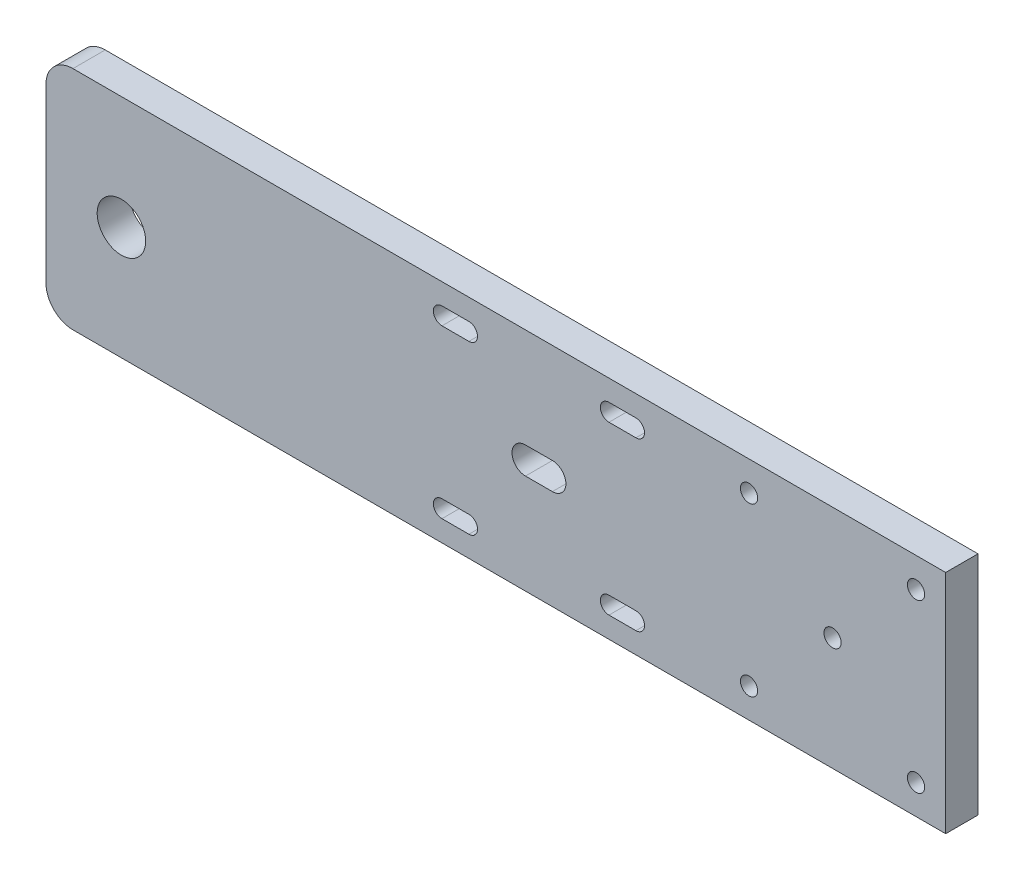
ISO-10303-21;
HEADER;
FILE_DESCRIPTION(('STEP AP214'),'2;1');
FILE_NAME('part.step','',(''),(''),'','','');
FILE_SCHEMA(('AUTOMOTIVE_DESIGN { 1 0 10303 214 1 1 1 1 }'));
ENDSEC;
DATA;
#1=APPLICATION_CONTEXT('core data for automotive mechanical design processes');
#2=APPLICATION_PROTOCOL_DEFINITION('international standard','automotive_design',2000,#1);
#3=PRODUCT_CONTEXT('',#1,'mechanical');
#4=PRODUCT('Part','Part','',(#3));
#5=PRODUCT_RELATED_PRODUCT_CATEGORY('part','',(#4));
#6=PRODUCT_DEFINITION_FORMATION('','',#4);
#7=PRODUCT_DEFINITION_CONTEXT('part definition',#1,'design');
#8=PRODUCT_DEFINITION('design','',#6,#7);
#9=PRODUCT_DEFINITION_SHAPE('','',#8);
#10=(LENGTH_UNIT() NAMED_UNIT(*) SI_UNIT(.MILLI.,.METRE.));
#11=(NAMED_UNIT(*) PLANE_ANGLE_UNIT() SI_UNIT($,.RADIAN.));
#12=(NAMED_UNIT(*) SI_UNIT($,.STERADIAN.) SOLID_ANGLE_UNIT());
#13=UNCERTAINTY_MEASURE_WITH_UNIT(LENGTH_MEASURE(1.E-05),#10,'distance_accuracy_value','');
#14=(GEOMETRIC_REPRESENTATION_CONTEXT(3) GLOBAL_UNCERTAINTY_ASSIGNED_CONTEXT((#13)) GLOBAL_UNIT_ASSIGNED_CONTEXT((#10,
#11,#12)) REPRESENTATION_CONTEXT('',''));
#15=CARTESIAN_POINT('',(0.,0.,0.));
#16=DIRECTION('',(0.,0.,1.));
#17=DIRECTION('',(1.,0.,0.));
#18=AXIS2_PLACEMENT_3D('',#15,#16,#17);
#19=CARTESIAN_POINT('',(-52.,0.,6.));
#20=DIRECTION('',(0.,0.,-1.));
#21=DIRECTION('',(-1.,0.,0.));
#22=AXIS2_PLACEMENT_3D('',#19,#20,#21);
#23=CYLINDRICAL_SURFACE('',#22,2.5);
#24=CARTESIAN_POINT('',(-52.,0.,0.));
#25=DIRECTION('',(0.,0.,1.));
#26=DIRECTION('',(1.,0.,0.));
#27=AXIS2_PLACEMENT_3D('',#24,#25,#26);
#28=CIRCLE('',#27,2.5);
#29=CARTESIAN_POINT('',(-52.,-2.5,0.));
#30=VERTEX_POINT('',#29);
#31=CARTESIAN_POINT('',(-52.,2.5,0.));
#32=VERTEX_POINT('',#31);
#33=EDGE_CURVE('E396',#30,#32,#28,.T.);
#34=ORIENTED_EDGE('',*,*,#33,.F.);
#35=DIRECTION('',(0.,0.,-1.));
#36=VECTOR('',#35,1.);
#37=CARTESIAN_POINT('',(-52.,-2.5,6.));
#38=LINE('',#37,#36);
#39=CARTESIAN_POINT('',(-52.,-2.5,6.));
#40=VERTEX_POINT('',#39);
#41=EDGE_CURVE('E429',#40,#30,#38,.T.);
#42=ORIENTED_EDGE('',*,*,#41,.F.);
#43=CARTESIAN_POINT('',(-52.,0.,6.));
#44=DIRECTION('',(0.,0.,1.));
#45=DIRECTION('',(1.,0.,0.));
#46=AXIS2_PLACEMENT_3D('',#43,#44,#45);
#47=CIRCLE('',#46,2.5);
#48=CARTESIAN_POINT('',(-52.,2.5,6.));
#49=VERTEX_POINT('',#48);
#50=EDGE_CURVE('E312',#40,#49,#47,.T.);
#51=ORIENTED_EDGE('',*,*,#50,.T.);
#52=DIRECTION('',(0.,0.,-1.));
#53=VECTOR('',#52,1.);
#54=CARTESIAN_POINT('',(-52.,2.5,6.));
#55=LINE('',#54,#53);
#56=EDGE_CURVE('E422',#49,#32,#55,.T.);
#57=ORIENTED_EDGE('',*,*,#56,.T.);
#58=EDGE_LOOP('',(#34,#42,#51,#57));
#59=FACE_BOUND('',#58,.T.);
#60=ADVANCED_FACE('F62',(#59),#23,.F.);
#61=CARTESIAN_POINT('',(0.,-2.5,6.));
#62=DIRECTION('',(0.,1.,0.));
#63=DIRECTION('',(0.,0.,1.));
#64=AXIS2_PLACEMENT_3D('',#61,#62,#63);
#65=PLANE('',#64);
#66=DIRECTION('',(1.,0.,0.));
#67=VECTOR('',#66,1.);
#68=CARTESIAN_POINT('',(0.,-2.5,0.));
#69=LINE('',#68,#67);
#70=CARTESIAN_POINT('',(-57.,-2.5,0.));
#71=VERTEX_POINT('',#70);
#72=EDGE_CURVE('E399',#71,#30,#69,.T.);
#73=ORIENTED_EDGE('',*,*,#72,.F.);
#74=DIRECTION('',(0.,0.,-1.));
#75=VECTOR('',#74,1.);
#76=CARTESIAN_POINT('',(-57.,-2.5,6.));
#77=LINE('',#76,#75);
#78=CARTESIAN_POINT('',(-57.,-2.5,6.));
#79=VERTEX_POINT('',#78);
#80=EDGE_CURVE('E427',#79,#71,#77,.T.);
#81=ORIENTED_EDGE('',*,*,#80,.F.);
#82=DIRECTION('',(1.,0.,0.));
#83=VECTOR('',#82,1.);
#84=CARTESIAN_POINT('',(0.,-2.5,6.));
#85=LINE('',#84,#83);
#86=EDGE_CURVE('E315',#79,#40,#85,.T.);
#87=ORIENTED_EDGE('',*,*,#86,.T.);
#88=ORIENTED_EDGE('',*,*,#41,.T.);
#89=EDGE_LOOP('',(#73,#81,#87,#88));
#90=FACE_BOUND('',#89,.T.);
#91=ADVANCED_FACE('F520',(#90),#65,.T.);
#92=CARTESIAN_POINT('',(-57.,0.,6.));
#93=DIRECTION('',(0.,0.,-1.));
#94=DIRECTION('',(-1.,0.,0.));
#95=AXIS2_PLACEMENT_3D('',#92,#93,#94);
#96=CYLINDRICAL_SURFACE('',#95,2.5);
#97=CARTESIAN_POINT('',(-57.,0.,0.));
#98=DIRECTION('',(0.,0.,1.));
#99=DIRECTION('',(1.,0.,0.));
#100=AXIS2_PLACEMENT_3D('',#97,#98,#99);
#101=CIRCLE('',#100,2.5);
#102=CARTESIAN_POINT('',(-57.,2.5,0.));
#103=VERTEX_POINT('',#102);
#104=EDGE_CURVE('E402',#103,#71,#101,.T.);
#105=ORIENTED_EDGE('',*,*,#104,.F.);
#106=DIRECTION('',(0.,0.,-1.));
#107=VECTOR('',#106,1.);
#108=CARTESIAN_POINT('',(-57.,2.5,6.));
#109=LINE('',#108,#107);
#110=CARTESIAN_POINT('',(-57.,2.5,6.));
#111=VERTEX_POINT('',#110);
#112=EDGE_CURVE('E424',#111,#103,#109,.T.);
#113=ORIENTED_EDGE('',*,*,#112,.F.);
#114=CARTESIAN_POINT('',(-57.,0.,6.));
#115=DIRECTION('',(0.,0.,1.));
#116=DIRECTION('',(1.,0.,0.));
#117=AXIS2_PLACEMENT_3D('',#114,#115,#116);
#118=CIRCLE('',#117,2.5);
#119=EDGE_CURVE('E318',#111,#79,#118,.T.);
#120=ORIENTED_EDGE('',*,*,#119,.T.);
#121=ORIENTED_EDGE('',*,*,#80,.T.);
#122=EDGE_LOOP('',(#105,#113,#120,#121));
#123=FACE_BOUND('',#122,.T.);
#124=ADVANCED_FACE('F508',(#123),#96,.F.);
#125=CARTESIAN_POINT('',(0.,-21.,6.));
#126=DIRECTION('',(0.,-1.,0.));
#127=DIRECTION('',(1.,0.,0.));
#128=AXIS2_PLACEMENT_3D('',#125,#126,#127);
#129=PLANE('',#128);
#130=DIRECTION('',(-1.,0.,0.));
#131=VECTOR('',#130,1.);
#132=CARTESIAN_POINT('',(0.,-21.,6.));
#133=LINE('',#132,#131);
#134=CARTESIAN_POINT('',(21.,-21.,6.));
#135=VERTEX_POINT('',#134);
#136=CARTESIAN_POINT('',(-141.,-21.,6.));
#137=VERTEX_POINT('',#136);
#138=EDGE_CURVE('E304',#135,#137,#133,.T.);
#139=ORIENTED_EDGE('',*,*,#138,.T.);
#140=DIRECTION('',(0.,0.,-1.));
#141=VECTOR('',#140,1.);
#142=CARTESIAN_POINT('',(-141.,-21.,0.));
#143=LINE('',#142,#141);
#144=CARTESIAN_POINT('',(-141.,-21.,0.));
#145=VERTEX_POINT('',#144);
#146=EDGE_CURVE('E431',#137,#145,#143,.T.);
#147=ORIENTED_EDGE('',*,*,#146,.T.);
#148=DIRECTION('',(-1.,0.,0.));
#149=VECTOR('',#148,1.);
#150=CARTESIAN_POINT('',(0.,-21.,0.));
#151=LINE('',#150,#149);
#152=CARTESIAN_POINT('',(21.,-21.,0.));
#153=VERTEX_POINT('',#152);
#154=EDGE_CURVE('E388',#153,#145,#151,.T.);
#155=ORIENTED_EDGE('',*,*,#154,.F.);
#156=DIRECTION('',(0.,0.,-1.));
#157=VECTOR('',#156,1.);
#158=CARTESIAN_POINT('',(21.,-21.,6.));
#159=LINE('',#158,#157);
#160=EDGE_CURVE('E425',#135,#153,#159,.T.);
#161=ORIENTED_EDGE('',*,*,#160,.F.);
#162=EDGE_LOOP('',(#139,#147,#155,#161));
#163=FACE_BOUND('',#162,.T.);
#164=ADVANCED_FACE('F484',(#163),#129,.T.);
#165=CARTESIAN_POINT('',(21.,0.,6.));
#166=DIRECTION('',(1.,0.,0.));
#167=DIRECTION('',(0.,1.,0.));
#168=AXIS2_PLACEMENT_3D('',#165,#166,#167);
#169=PLANE('',#168);
#170=DIRECTION('',(0.,-1.,0.));
#171=VECTOR('',#170,1.);
#172=CARTESIAN_POINT('',(21.,0.,0.));
#173=LINE('',#172,#171);
#174=CARTESIAN_POINT('',(21.,21.,0.));
#175=VERTEX_POINT('',#174);
#176=EDGE_CURVE('E391',#175,#153,#173,.T.);
#177=ORIENTED_EDGE('',*,*,#176,.F.);
#178=DIRECTION('',(0.,0.,-1.));
#179=VECTOR('',#178,1.);
#180=CARTESIAN_POINT('',(21.,21.,6.));
#181=LINE('',#180,#179);
#182=CARTESIAN_POINT('',(21.,21.,6.));
#183=VERTEX_POINT('',#182);
#184=EDGE_CURVE('E432',#183,#175,#181,.T.);
#185=ORIENTED_EDGE('',*,*,#184,.F.);
#186=DIRECTION('',(0.,-1.,0.));
#187=VECTOR('',#186,1.);
#188=CARTESIAN_POINT('',(21.,0.,6.));
#189=LINE('',#188,#187);
#190=EDGE_CURVE('E307',#183,#135,#189,.T.);
#191=ORIENTED_EDGE('',*,*,#190,.T.);
#192=ORIENTED_EDGE('',*,*,#160,.T.);
#193=EDGE_LOOP('',(#177,#185,#191,#192));
#194=FACE_BOUND('',#193,.T.);
#195=ADVANCED_FACE('F499',(#194),#169,.T.);
#196=CARTESIAN_POINT('',(0.,21.,6.));
#197=DIRECTION('',(0.,-1.,0.));
#198=DIRECTION('',(1.,0.,0.));
#199=AXIS2_PLACEMENT_3D('',#196,#197,#198);
#200=PLANE('',#199);
#201=DIRECTION('',(-1.,0.,0.));
#202=VECTOR('',#201,1.);
#203=CARTESIAN_POINT('',(0.,21.,0.));
#204=LINE('',#203,#202);
#205=CARTESIAN_POINT('',(-141.,21.,0.));
#206=VERTEX_POINT('',#205);
#207=EDGE_CURVE('E394',#175,#206,#204,.T.);
#208=ORIENTED_EDGE('',*,*,#207,.T.);
#209=DIRECTION('',(0.,0.,-1.));
#210=VECTOR('',#209,1.);
#211=CARTESIAN_POINT('',(-141.,21.,6.));
#212=LINE('',#211,#210);
#213=CARTESIAN_POINT('',(-141.,21.,6.));
#214=VERTEX_POINT('',#213);
#215=EDGE_CURVE('E12',#206,#214,#212,.F.);
#216=ORIENTED_EDGE('',*,*,#215,.T.);
#217=DIRECTION('',(-1.,0.,0.));
#218=VECTOR('',#217,1.);
#219=CARTESIAN_POINT('',(0.,21.,6.));
#220=LINE('',#219,#218);
#221=EDGE_CURVE('E310',#183,#214,#220,.T.);
#222=ORIENTED_EDGE('',*,*,#221,.F.);
#223=ORIENTED_EDGE('',*,*,#184,.T.);
#224=EDGE_LOOP('',(#208,#216,#222,#223));
#225=FACE_BOUND('',#224,.T.);
#226=ADVANCED_FACE('F497',(#225),#200,.F.);
#227=CARTESIAN_POINT('',(-72.5000000000001,15.5,6.));
#228=DIRECTION('',(0.,0.,-1.));
#229=DIRECTION('',(-1.,0.,0.));
#230=AXIS2_PLACEMENT_3D('',#227,#228,#229);
#231=CYLINDRICAL_SURFACE('',#230,1.6);
#232=CARTESIAN_POINT('',(-72.5000000000001,15.5,0.));
#233=DIRECTION('',(0.,0.,1.));
#234=DIRECTION('',(1.,0.,0.));
#235=AXIS2_PLACEMENT_3D('',#232,#233,#234);
#236=CIRCLE('',#235,1.6);
#237=CARTESIAN_POINT('',(-72.5000000000001,17.1,0.));
#238=VERTEX_POINT('',#237);
#239=CARTESIAN_POINT('',(-72.5000000000001,13.9,0.));
#240=VERTEX_POINT('',#239);
#241=EDGE_CURVE('E373',#238,#240,#236,.T.);
#242=ORIENTED_EDGE('',*,*,#241,.F.);
#243=DIRECTION('',(0.,0.,-1.));
#244=VECTOR('',#243,1.);
#245=CARTESIAN_POINT('',(-72.5000000000001,17.1,6.));
#246=LINE('',#245,#244);
#247=CARTESIAN_POINT('',(-72.5000000000001,17.1,6.));
#248=VERTEX_POINT('',#247);
#249=EDGE_CURVE('E434',#248,#238,#246,.T.);
#250=ORIENTED_EDGE('',*,*,#249,.F.);
#251=CARTESIAN_POINT('',(-72.5000000000001,15.5,6.));
#252=DIRECTION('',(0.,0.,1.));
#253=DIRECTION('',(1.,0.,0.));
#254=AXIS2_PLACEMENT_3D('',#251,#252,#253);
#255=CIRCLE('',#254,1.6);
#256=CARTESIAN_POINT('',(-72.5000000000001,13.9,6.));
#257=VERTEX_POINT('',#256);
#258=EDGE_CURVE('E290',#248,#257,#255,.T.);
#259=ORIENTED_EDGE('',*,*,#258,.T.);
#260=DIRECTION('',(0.,0.,-1.));
#261=VECTOR('',#260,1.);
#262=CARTESIAN_POINT('',(-72.5000000000001,13.9,6.));
#263=LINE('',#262,#261);
#264=EDGE_CURVE('E436',#257,#240,#263,.T.);
#265=ORIENTED_EDGE('',*,*,#264,.T.);
#266=EDGE_LOOP('',(#242,#250,#259,#265));
#267=FACE_BOUND('',#266,.T.);
#268=ADVANCED_FACE('F506',(#267),#231,.F.);
#269=CARTESIAN_POINT('',(0.,17.1,6.));
#270=DIRECTION('',(0.,1.,0.));
#271=DIRECTION('',(0.,0.,1.));
#272=AXIS2_PLACEMENT_3D('',#269,#270,#271);
#273=PLANE('',#272);
#274=DIRECTION('',(1.,0.,0.));
#275=VECTOR('',#274,1.);
#276=CARTESIAN_POINT('',(0.,17.1,0.));
#277=LINE('',#276,#275);
#278=CARTESIAN_POINT('',(-67.5000000000001,17.1,0.));
#279=VERTEX_POINT('',#278);
#280=EDGE_CURVE('E376',#238,#279,#277,.T.);
#281=ORIENTED_EDGE('',*,*,#280,.T.);
#282=DIRECTION('',(0.,0.,-1.));
#283=VECTOR('',#282,1.);
#284=CARTESIAN_POINT('',(-67.5000000000001,17.1,6.));
#285=LINE('',#284,#283);
#286=CARTESIAN_POINT('',(-67.5000000000001,17.1,6.));
#287=VERTEX_POINT('',#286);
#288=EDGE_CURVE('E441',#287,#279,#285,.T.);
#289=ORIENTED_EDGE('',*,*,#288,.F.);
#290=DIRECTION('',(1.,0.,0.));
#291=VECTOR('',#290,1.);
#292=CARTESIAN_POINT('',(0.,17.1,6.));
#293=LINE('',#292,#291);
#294=EDGE_CURVE('E293',#248,#287,#293,.T.);
#295=ORIENTED_EDGE('',*,*,#294,.F.);
#296=ORIENTED_EDGE('',*,*,#249,.T.);
#297=EDGE_LOOP('',(#281,#289,#295,#296));
#298=FACE_BOUND('',#297,.T.);
#299=ADVANCED_FACE('F796',(#298),#273,.F.);
#300=CARTESIAN_POINT('',(-67.5000000000001,15.5,6.));
#301=DIRECTION('',(0.,0.,-1.));
#302=DIRECTION('',(-1.,0.,0.));
#303=AXIS2_PLACEMENT_3D('',#300,#301,#302);
#304=CYLINDRICAL_SURFACE('',#303,1.6);
#305=CARTESIAN_POINT('',(-67.5000000000001,15.5,0.));
#306=DIRECTION('',(0.,0.,1.));
#307=DIRECTION('',(1.,0.,0.));
#308=AXIS2_PLACEMENT_3D('',#305,#306,#307);
#309=CIRCLE('',#308,1.6);
#310=CARTESIAN_POINT('',(-67.5000000000001,13.9,0.));
#311=VERTEX_POINT('',#310);
#312=EDGE_CURVE('E379',#311,#279,#309,.T.);
#313=ORIENTED_EDGE('',*,*,#312,.F.);
#314=DIRECTION('',(0.,0.,-1.));
#315=VECTOR('',#314,1.);
#316=CARTESIAN_POINT('',(-67.5000000000001,13.9,6.));
#317=LINE('',#316,#315);
#318=CARTESIAN_POINT('',(-67.5000000000001,13.9,6.));
#319=VERTEX_POINT('',#318);
#320=EDGE_CURVE('E438',#319,#311,#317,.T.);
#321=ORIENTED_EDGE('',*,*,#320,.F.);
#322=CARTESIAN_POINT('',(-67.5000000000001,15.5,6.));
#323=DIRECTION('',(0.,0.,1.));
#324=DIRECTION('',(1.,0.,0.));
#325=AXIS2_PLACEMENT_3D('',#322,#323,#324);
#326=CIRCLE('',#325,1.6);
#327=EDGE_CURVE('E295',#319,#287,#326,.T.);
#328=ORIENTED_EDGE('',*,*,#327,.T.);
#329=ORIENTED_EDGE('',*,*,#288,.T.);
#330=EDGE_LOOP('',(#313,#321,#328,#329));
#331=FACE_BOUND('',#330,.T.);
#332=ADVANCED_FACE('F787',(#331),#304,.F.);
#333=CARTESIAN_POINT('',(-72.5000000000001,-15.5,6.));
#334=DIRECTION('',(0.,0.,-1.));
#335=DIRECTION('',(-1.,0.,0.));
#336=AXIS2_PLACEMENT_3D('',#333,#334,#335);
#337=CYLINDRICAL_SURFACE('',#336,1.6);
#338=CARTESIAN_POINT('',(-72.5000000000001,-15.5,0.));
#339=DIRECTION('',(0.,0.,1.));
#340=DIRECTION('',(1.,0.,0.));
#341=AXIS2_PLACEMENT_3D('',#338,#339,#340);
#342=CIRCLE('',#341,1.6);
#343=CARTESIAN_POINT('',(-72.5000000000001,-13.9,0.));
#344=VERTEX_POINT('',#343);
#345=CARTESIAN_POINT('',(-72.5000000000001,-17.1,0.));
#346=VERTEX_POINT('',#345);
#347=EDGE_CURVE('E361',#344,#346,#342,.T.);
#348=ORIENTED_EDGE('',*,*,#347,.F.);
#349=DIRECTION('',(0.,0.,-1.));
#350=VECTOR('',#349,1.);
#351=CARTESIAN_POINT('',(-72.5000000000001,-13.9,6.));
#352=LINE('',#351,#350);
#353=CARTESIAN_POINT('',(-72.5000000000001,-13.9,6.));
#354=VERTEX_POINT('',#353);
#355=EDGE_CURVE('E439',#354,#344,#352,.T.);
#356=ORIENTED_EDGE('',*,*,#355,.F.);
#357=CARTESIAN_POINT('',(-72.5000000000001,-15.5,6.));
#358=DIRECTION('',(0.,0.,1.));
#359=DIRECTION('',(1.,0.,0.));
#360=AXIS2_PLACEMENT_3D('',#357,#358,#359);
#361=CIRCLE('',#360,1.6);
#362=CARTESIAN_POINT('',(-72.5000000000001,-17.1,6.));
#363=VERTEX_POINT('',#362);
#364=EDGE_CURVE('E279',#354,#363,#361,.T.);
#365=ORIENTED_EDGE('',*,*,#364,.T.);
#366=DIRECTION('',(0.,0.,-1.));
#367=VECTOR('',#366,1.);
#368=CARTESIAN_POINT('',(-72.5000000000001,-17.1,6.));
#369=LINE('',#368,#367);
#370=EDGE_CURVE('E444',#363,#346,#369,.T.);
#371=ORIENTED_EDGE('',*,*,#370,.T.);
#372=EDGE_LOOP('',(#348,#356,#365,#371));
#373=FACE_BOUND('',#372,.T.);
#374=ADVANCED_FACE('F778',(#373),#337,.F.);
#375=CARTESIAN_POINT('',(0.,-13.9,6.));
#376=DIRECTION('',(0.,1.,0.));
#377=DIRECTION('',(-1.,0.,0.));
#378=AXIS2_PLACEMENT_3D('',#375,#376,#377);
#379=PLANE('',#378);
#380=DIRECTION('',(1.,0.,0.));
#381=VECTOR('',#380,1.);
#382=CARTESIAN_POINT('',(0.,-13.9,0.));
#383=LINE('',#382,#381);
#384=CARTESIAN_POINT('',(-67.5000000000001,-13.9,0.));
#385=VERTEX_POINT('',#384);
#386=EDGE_CURVE('E364',#344,#385,#383,.T.);
#387=ORIENTED_EDGE('',*,*,#386,.T.);
#388=DIRECTION('',(0.,0.,-1.));
#389=VECTOR('',#388,1.);
#390=CARTESIAN_POINT('',(-67.5000000000001,-13.9,6.));
#391=LINE('',#390,#389);
#392=CARTESIAN_POINT('',(-67.5000000000001,-13.9,6.));
#393=VERTEX_POINT('',#392);
#394=EDGE_CURVE('E449',#393,#385,#391,.T.);
#395=ORIENTED_EDGE('',*,*,#394,.F.);
#396=DIRECTION('',(1.,0.,0.));
#397=VECTOR('',#396,1.);
#398=CARTESIAN_POINT('',(0.,-13.9,6.));
#399=LINE('',#398,#397);
#400=EDGE_CURVE('E282',#354,#393,#399,.T.);
#401=ORIENTED_EDGE('',*,*,#400,.F.);
#402=ORIENTED_EDGE('',*,*,#355,.T.);
#403=EDGE_LOOP('',(#387,#395,#401,#402));
#404=FACE_BOUND('',#403,.T.);
#405=ADVANCED_FACE('F769',(#404),#379,.F.);
#406=CARTESIAN_POINT('',(-67.5000000000001,-15.5,6.));
#407=DIRECTION('',(0.,0.,-1.));
#408=DIRECTION('',(-1.,0.,0.));
#409=AXIS2_PLACEMENT_3D('',#406,#407,#408);
#410=CYLINDRICAL_SURFACE('',#409,1.6);
#411=CARTESIAN_POINT('',(-67.5000000000001,-15.5,0.));
#412=DIRECTION('',(0.,0.,1.));
#413=DIRECTION('',(1.,0.,0.));
#414=AXIS2_PLACEMENT_3D('',#411,#412,#413);
#415=CIRCLE('',#414,1.6);
#416=CARTESIAN_POINT('',(-67.5000000000001,-17.1,0.));
#417=VERTEX_POINT('',#416);
#418=EDGE_CURVE('E367',#417,#385,#415,.T.);
#419=ORIENTED_EDGE('',*,*,#418,.F.);
#420=DIRECTION('',(0.,0.,-1.));
#421=VECTOR('',#420,1.);
#422=CARTESIAN_POINT('',(-67.5000000000001,-17.1,6.));
#423=LINE('',#422,#421);
#424=CARTESIAN_POINT('',(-67.5000000000001,-17.1,6.));
#425=VERTEX_POINT('',#424);
#426=EDGE_CURVE('E446',#425,#417,#423,.T.);
#427=ORIENTED_EDGE('',*,*,#426,.F.);
#428=CARTESIAN_POINT('',(-67.5000000000001,-15.5,6.));
#429=DIRECTION('',(0.,0.,1.));
#430=DIRECTION('',(1.,0.,0.));
#431=AXIS2_PLACEMENT_3D('',#428,#429,#430);
#432=CIRCLE('',#431,1.6);
#433=EDGE_CURVE('E284',#425,#393,#432,.T.);
#434=ORIENTED_EDGE('',*,*,#433,.T.);
#435=ORIENTED_EDGE('',*,*,#394,.T.);
#436=EDGE_LOOP('',(#419,#427,#434,#435));
#437=FACE_BOUND('',#436,.T.);
#438=ADVANCED_FACE('F760',(#437),#410,.F.);
#439=CARTESIAN_POINT('',(-36.5000000000001,15.5,6.));
#440=DIRECTION('',(0.,0.,-1.));
#441=DIRECTION('',(-1.,0.,0.));
#442=AXIS2_PLACEMENT_3D('',#439,#440,#441);
#443=CYLINDRICAL_SURFACE('',#442,1.6);
#444=CARTESIAN_POINT('',(-36.5000000000001,15.5,0.));
#445=DIRECTION('',(0.,0.,1.));
#446=DIRECTION('',(1.,0.,0.));
#447=AXIS2_PLACEMENT_3D('',#444,#445,#446);
#448=CIRCLE('',#447,1.6);
#449=CARTESIAN_POINT('',(-36.5000000000001,13.9,0.));
#450=VERTEX_POINT('',#449);
#451=CARTESIAN_POINT('',(-36.5000000000001,17.1,0.));
#452=VERTEX_POINT('',#451);
#453=EDGE_CURVE('E349',#450,#452,#448,.T.);
#454=ORIENTED_EDGE('',*,*,#453,.F.);
#455=DIRECTION('',(0.,0.,-1.));
#456=VECTOR('',#455,1.);
#457=CARTESIAN_POINT('',(-36.5000000000001,13.9,6.));
#458=LINE('',#457,#456);
#459=CARTESIAN_POINT('',(-36.5000000000001,13.9,6.));
#460=VERTEX_POINT('',#459);
#461=EDGE_CURVE('E447',#460,#450,#458,.T.);
#462=ORIENTED_EDGE('',*,*,#461,.F.);
#463=CARTESIAN_POINT('',(-36.5000000000001,15.5,6.));
#464=DIRECTION('',(0.,0.,1.));
#465=DIRECTION('',(1.,0.,0.));
#466=AXIS2_PLACEMENT_3D('',#463,#464,#465);
#467=CIRCLE('',#466,1.6);
#468=CARTESIAN_POINT('',(-36.5000000000001,17.1,6.));
#469=VERTEX_POINT('',#468);
#470=EDGE_CURVE('E268',#460,#469,#467,.T.);
#471=ORIENTED_EDGE('',*,*,#470,.T.);
#472=DIRECTION('',(0.,0.,-1.));
#473=VECTOR('',#472,1.);
#474=CARTESIAN_POINT('',(-36.5000000000001,17.1,6.));
#475=LINE('',#474,#473);
#476=EDGE_CURVE('E259',#469,#452,#475,.T.);
#477=ORIENTED_EDGE('',*,*,#476,.T.);
#478=EDGE_LOOP('',(#454,#462,#471,#477));
#479=FACE_BOUND('',#478,.T.);
#480=ADVANCED_FACE('F751',(#479),#443,.F.);
#481=CARTESIAN_POINT('',(0.,13.9,6.));
#482=DIRECTION('',(0.,1.,0.));
#483=DIRECTION('',(0.,0.,1.));
#484=AXIS2_PLACEMENT_3D('',#481,#482,#483);
#485=PLANE('',#484);
#486=DIRECTION('',(1.,0.,0.));
#487=VECTOR('',#486,1.);
#488=CARTESIAN_POINT('',(0.,13.9,0.));
#489=LINE('',#488,#487);
#490=CARTESIAN_POINT('',(-41.4999999999999,13.9,0.));
#491=VERTEX_POINT('',#490);
#492=EDGE_CURVE('E352',#491,#450,#489,.T.);
#493=ORIENTED_EDGE('',*,*,#492,.F.);
#494=DIRECTION('',(0.,0.,-1.));
#495=VECTOR('',#494,1.);
#496=CARTESIAN_POINT('',(-41.4999999999999,13.9,6.));
#497=LINE('',#496,#495);
#498=CARTESIAN_POINT('',(-41.4999999999999,13.9,6.));
#499=VERTEX_POINT('',#498);
#500=EDGE_CURVE('E455',#499,#491,#497,.T.);
#501=ORIENTED_EDGE('',*,*,#500,.F.);
#502=DIRECTION('',(1.,0.,0.));
#503=VECTOR('',#502,1.);
#504=CARTESIAN_POINT('',(0.,13.9,6.));
#505=LINE('',#504,#503);
#506=EDGE_CURVE('E271',#499,#460,#505,.T.);
#507=ORIENTED_EDGE('',*,*,#506,.T.);
#508=ORIENTED_EDGE('',*,*,#461,.T.);
#509=EDGE_LOOP('',(#493,#501,#507,#508));
#510=FACE_BOUND('',#509,.T.);
#511=ADVANCED_FACE('F742',(#510),#485,.T.);
#512=CARTESIAN_POINT('',(-41.4999999999999,15.5,6.));
#513=DIRECTION('',(0.,0.,-1.));
#514=DIRECTION('',(-1.,0.,0.));
#515=AXIS2_PLACEMENT_3D('',#512,#513,#514);
#516=CYLINDRICAL_SURFACE('',#515,1.6);
#517=CARTESIAN_POINT('',(-41.4999999999999,15.5,0.));
#518=DIRECTION('',(0.,0.,1.));
#519=DIRECTION('',(1.,0.,0.));
#520=AXIS2_PLACEMENT_3D('',#517,#518,#519);
#521=CIRCLE('',#520,1.6);
#522=CARTESIAN_POINT('',(-41.4999999999999,17.1,0.));
#523=VERTEX_POINT('',#522);
#524=EDGE_CURVE('E355',#523,#491,#521,.T.);
#525=ORIENTED_EDGE('',*,*,#524,.F.);
#526=DIRECTION('',(0.,0.,-1.));
#527=VECTOR('',#526,1.);
#528=CARTESIAN_POINT('',(-41.4999999999999,17.1,6.));
#529=LINE('',#528,#527);
#530=CARTESIAN_POINT('',(-41.4999999999999,17.1,6.));
#531=VERTEX_POINT('',#530);
#532=EDGE_CURVE('E453',#531,#523,#529,.T.);
#533=ORIENTED_EDGE('',*,*,#532,.F.);
#534=CARTESIAN_POINT('',(-41.4999999999999,15.5,6.));
#535=DIRECTION('',(0.,0.,1.));
#536=DIRECTION('',(1.,0.,0.));
#537=AXIS2_PLACEMENT_3D('',#534,#535,#536);
#538=CIRCLE('',#537,1.6);
#539=EDGE_CURVE('E274',#531,#499,#538,.T.);
#540=ORIENTED_EDGE('',*,*,#539,.T.);
#541=ORIENTED_EDGE('',*,*,#500,.T.);
#542=EDGE_LOOP('',(#525,#533,#540,#541));
#543=FACE_BOUND('',#542,.T.);
#544=ADVANCED_FACE('F735',(#543),#516,.F.);
#545=CARTESIAN_POINT('',(0.,-13.9,6.));
#546=DIRECTION('',(0.,1.,0.));
#547=DIRECTION('',(-1.,0.,0.));
#548=AXIS2_PLACEMENT_3D('',#545,#546,#547);
#549=PLANE('',#548);
#550=DIRECTION('',(1.,0.,0.));
#551=VECTOR('',#550,1.);
#552=CARTESIAN_POINT('',(0.,-13.9,0.));
#553=LINE('',#552,#551);
#554=CARTESIAN_POINT('',(-41.5000000000001,-13.9,0.));
#555=VERTEX_POINT('',#554);
#556=CARTESIAN_POINT('',(-36.5000000000001,-13.9,0.));
#557=VERTEX_POINT('',#556);
#558=EDGE_CURVE('E255',#555,#557,#553,.T.);
#559=ORIENTED_EDGE('',*,*,#558,.T.);
#560=DIRECTION('',(0.,0.,-1.));
#561=VECTOR('',#560,1.);
#562=CARTESIAN_POINT('',(-36.5000000000001,-13.9,6.));
#563=LINE('',#562,#561);
#564=CARTESIAN_POINT('',(-36.5000000000001,-13.9,6.));
#565=VERTEX_POINT('',#564);
#566=EDGE_CURVE('E252',#565,#557,#563,.T.);
#567=ORIENTED_EDGE('',*,*,#566,.F.);
#568=DIRECTION('',(1.,0.,0.));
#569=VECTOR('',#568,1.);
#570=CARTESIAN_POINT('',(0.,-13.9,6.));
#571=LINE('',#570,#569);
#572=CARTESIAN_POINT('',(-41.5000000000001,-13.9,6.));
#573=VERTEX_POINT('',#572);
#574=EDGE_CURVE('E238',#573,#565,#571,.T.);
#575=ORIENTED_EDGE('',*,*,#574,.F.);
#576=DIRECTION('',(0.,0.,-1.));
#577=VECTOR('',#576,1.);
#578=CARTESIAN_POINT('',(-41.5000000000001,-13.9,6.));
#579=LINE('',#578,#577);
#580=EDGE_CURVE('E338',#573,#555,#579,.T.);
#581=ORIENTED_EDGE('',*,*,#580,.T.);
#582=EDGE_LOOP('',(#559,#567,#575,#581));
#583=FACE_BOUND('',#582,.T.);
#584=ADVANCED_FACE('F253',(#583),#549,.F.);
#585=CARTESIAN_POINT('',(-36.5,-15.5,6.));
#586=DIRECTION('',(0.,0.,-1.));
#587=DIRECTION('',(-1.,0.,0.));
#588=AXIS2_PLACEMENT_3D('',#585,#586,#587);
#589=CYLINDRICAL_SURFACE('',#588,1.6);
#590=CARTESIAN_POINT('',(-36.5,-15.5,0.));
#591=DIRECTION('',(0.,0.,1.));
#592=DIRECTION('',(1.,0.,0.));
#593=AXIS2_PLACEMENT_3D('',#590,#591,#592);
#594=CIRCLE('',#593,1.6);
#595=CARTESIAN_POINT('',(-36.5000000000001,-17.1,0.));
#596=VERTEX_POINT('',#595);
#597=EDGE_CURVE('E340',#596,#557,#594,.T.);
#598=ORIENTED_EDGE('',*,*,#597,.F.);
#599=DIRECTION('',(0.,0.,-1.));
#600=VECTOR('',#599,1.);
#601=CARTESIAN_POINT('',(-36.5000000000001,-17.1,6.));
#602=LINE('',#601,#600);
#603=CARTESIAN_POINT('',(-36.5000000000001,-17.1,6.));
#604=VERTEX_POINT('',#603);
#605=EDGE_CURVE('E260',#604,#596,#602,.T.);
#606=ORIENTED_EDGE('',*,*,#605,.F.);
#607=CARTESIAN_POINT('',(-36.5,-15.5,6.));
#608=DIRECTION('',(0.,0.,1.));
#609=DIRECTION('',(1.,0.,0.));
#610=AXIS2_PLACEMENT_3D('',#607,#608,#609);
#611=CIRCLE('',#610,1.6);
#612=EDGE_CURVE('E244',#604,#565,#611,.T.);
#613=ORIENTED_EDGE('',*,*,#612,.T.);
#614=ORIENTED_EDGE('',*,*,#566,.T.);
#615=EDGE_LOOP('',(#598,#606,#613,#614));
#616=FACE_BOUND('',#615,.T.);
#617=ADVANCED_FACE('F262',(#616),#589,.F.);
#618=CARTESIAN_POINT('',(0.,-17.1,6.));
#619=DIRECTION('',(0.,1.,0.));
#620=DIRECTION('',(-1.,0.,0.));
#621=AXIS2_PLACEMENT_3D('',#618,#619,#620);
#622=PLANE('',#621);
#623=DIRECTION('',(1.,0.,0.));
#624=VECTOR('',#623,1.);
#625=CARTESIAN_POINT('',(0.,-17.1,0.));
#626=LINE('',#625,#624);
#627=CARTESIAN_POINT('',(-41.5000000000001,-17.1,0.));
#628=VERTEX_POINT('',#627);
#629=EDGE_CURVE('E343',#628,#596,#626,.T.);
#630=ORIENTED_EDGE('',*,*,#629,.F.);
#631=DIRECTION('',(0.,0.,-1.));
#632=VECTOR('',#631,1.);
#633=CARTESIAN_POINT('',(-41.5000000000001,-17.1,6.));
#634=LINE('',#633,#632);
#635=CARTESIAN_POINT('',(-41.5000000000001,-17.1,6.));
#636=VERTEX_POINT('',#635);
#637=EDGE_CURVE('E459',#636,#628,#634,.T.);
#638=ORIENTED_EDGE('',*,*,#637,.F.);
#639=DIRECTION('',(1.,0.,0.));
#640=VECTOR('',#639,1.);
#641=CARTESIAN_POINT('',(0.,-17.1,6.));
#642=LINE('',#641,#640);
#643=EDGE_CURVE('E263',#636,#604,#642,.T.);
#644=ORIENTED_EDGE('',*,*,#643,.T.);
#645=ORIENTED_EDGE('',*,*,#605,.T.);
#646=EDGE_LOOP('',(#630,#638,#644,#645));
#647=FACE_BOUND('',#646,.T.);
#648=ADVANCED_FACE('F553',(#647),#622,.T.);
#649=CARTESIAN_POINT('',(-15.5,15.5,6.));
#650=DIRECTION('',(0.,0.,-1.));
#651=DIRECTION('',(-1.,0.,0.));
#652=AXIS2_PLACEMENT_3D('',#649,#650,#651);
#653=CYLINDRICAL_SURFACE('',#652,1.6);
#654=CARTESIAN_POINT('',(-15.5,15.5,6.));
#655=DIRECTION('',(0.,0.,1.));
#656=DIRECTION('',(1.,0.,0.));
#657=AXIS2_PLACEMENT_3D('',#654,#655,#656);
#658=CIRCLE('',#657,1.6);
#659=CARTESIAN_POINT('',(-13.9,15.5,6.));
#660=VERTEX_POINT('',#659);
#661=EDGE_CURVE('E332',#660,#660,#658,.T.);
#662=ORIENTED_EDGE('',*,*,#661,.T.);
#663=EDGE_LOOP('',(#662));
#664=FACE_BOUND('',#663,.T.);
#665=CARTESIAN_POINT('',(-15.5,15.5,0.));
#666=DIRECTION('',(0.,0.,1.));
#667=DIRECTION('',(1.,0.,0.));
#668=AXIS2_PLACEMENT_3D('',#665,#666,#667);
#669=CIRCLE('',#668,1.6);
#670=CARTESIAN_POINT('',(-13.9,15.5,0.));
#671=VERTEX_POINT('',#670);
#672=EDGE_CURVE('E417',#671,#671,#669,.T.);
#673=ORIENTED_EDGE('',*,*,#672,.F.);
#674=EDGE_LOOP('',(#673));
#675=FACE_BOUND('',#674,.T.);
#676=ADVANCED_FACE('F549',(#664,#675),#653,.F.);
#677=CARTESIAN_POINT('',(15.5,15.5,6.));
#678=DIRECTION('',(0.,0.,-1.));
#679=DIRECTION('',(-1.,0.,0.));
#680=AXIS2_PLACEMENT_3D('',#677,#678,#679);
#681=CYLINDRICAL_SURFACE('',#680,1.6);
#682=CARTESIAN_POINT('',(15.5,15.5,6.));
#683=DIRECTION('',(0.,0.,1.));
#684=DIRECTION('',(1.,0.,0.));
#685=AXIS2_PLACEMENT_3D('',#682,#683,#684);
#686=CIRCLE('',#685,1.6);
#687=CARTESIAN_POINT('',(17.1,15.5,6.));
#688=VERTEX_POINT('',#687);
#689=EDGE_CURVE('E329',#688,#688,#686,.T.);
#690=ORIENTED_EDGE('',*,*,#689,.T.);
#691=EDGE_LOOP('',(#690));
#692=FACE_BOUND('',#691,.T.);
#693=CARTESIAN_POINT('',(15.5,15.5,0.));
#694=DIRECTION('',(0.,0.,1.));
#695=DIRECTION('',(1.,0.,0.));
#696=AXIS2_PLACEMENT_3D('',#693,#694,#695);
#697=CIRCLE('',#696,1.6);
#698=CARTESIAN_POINT('',(17.1,15.5,0.));
#699=VERTEX_POINT('',#698);
#700=EDGE_CURVE('E414',#699,#699,#697,.T.);
#701=ORIENTED_EDGE('',*,*,#700,.F.);
#702=EDGE_LOOP('',(#701));
#703=FACE_BOUND('',#702,.T.);
#704=ADVANCED_FACE('F545',(#692,#703),#681,.F.);
#705=CARTESIAN_POINT('',(-15.5,-15.5,6.));
#706=DIRECTION('',(0.,0.,-1.));
#707=DIRECTION('',(-1.,0.,0.));
#708=AXIS2_PLACEMENT_3D('',#705,#706,#707);
#709=CYLINDRICAL_SURFACE('',#708,1.6);
#710=CARTESIAN_POINT('',(-15.5,-15.5,6.));
#711=DIRECTION('',(0.,0.,1.));
#712=DIRECTION('',(1.,0.,0.));
#713=AXIS2_PLACEMENT_3D('',#710,#711,#712);
#714=CIRCLE('',#713,1.6);
#715=CARTESIAN_POINT('',(-13.9,-15.5,6.));
#716=VERTEX_POINT('',#715);
#717=EDGE_CURVE('E326',#716,#716,#714,.T.);
#718=ORIENTED_EDGE('',*,*,#717,.T.);
#719=EDGE_LOOP('',(#718));
#720=FACE_BOUND('',#719,.T.);
#721=CARTESIAN_POINT('',(-15.5,-15.5,0.));
#722=DIRECTION('',(0.,0.,1.));
#723=DIRECTION('',(1.,0.,0.));
#724=AXIS2_PLACEMENT_3D('',#721,#722,#723);
#725=CIRCLE('',#724,1.6);
#726=CARTESIAN_POINT('',(-13.9,-15.5,0.));
#727=VERTEX_POINT('',#726);
#728=EDGE_CURVE('E411',#727,#727,#725,.T.);
#729=ORIENTED_EDGE('',*,*,#728,.F.);
#730=EDGE_LOOP('',(#729));
#731=FACE_BOUND('',#730,.T.);
#732=ADVANCED_FACE('F541',(#720,#731),#709,.F.);
#733=CARTESIAN_POINT('',(15.5,-15.5,6.));
#734=DIRECTION('',(0.,0.,-1.));
#735=DIRECTION('',(-1.,0.,0.));
#736=AXIS2_PLACEMENT_3D('',#733,#734,#735);
#737=CYLINDRICAL_SURFACE('',#736,1.6);
#738=CARTESIAN_POINT('',(15.5,-15.5,6.));
#739=DIRECTION('',(0.,0.,1.));
#740=DIRECTION('',(1.,0.,0.));
#741=AXIS2_PLACEMENT_3D('',#738,#739,#740);
#742=CIRCLE('',#741,1.6);
#743=CARTESIAN_POINT('',(17.1,-15.5,6.));
#744=VERTEX_POINT('',#743);
#745=EDGE_CURVE('E323',#744,#744,#742,.T.);
#746=ORIENTED_EDGE('',*,*,#745,.T.);
#747=EDGE_LOOP('',(#746));
#748=FACE_BOUND('',#747,.T.);
#749=CARTESIAN_POINT('',(15.5,-15.5,0.));
#750=DIRECTION('',(0.,0.,1.));
#751=DIRECTION('',(1.,0.,0.));
#752=AXIS2_PLACEMENT_3D('',#749,#750,#751);
#753=CIRCLE('',#752,1.6);
#754=CARTESIAN_POINT('',(17.1,-15.5,0.));
#755=VERTEX_POINT('',#754);
#756=EDGE_CURVE('E408',#755,#755,#753,.T.);
#757=ORIENTED_EDGE('',*,*,#756,.F.);
#758=EDGE_LOOP('',(#757));
#759=FACE_BOUND('',#758,.T.);
#760=ADVANCED_FACE('F537',(#748,#759),#737,.F.);
#761=CARTESIAN_POINT('',(0.,2.5,6.));
#762=DIRECTION('',(0.,1.,0.));
#763=DIRECTION('',(0.,0.,1.));
#764=AXIS2_PLACEMENT_3D('',#761,#762,#763);
#765=PLANE('',#764);
#766=DIRECTION('',(1.,0.,0.));
#767=VECTOR('',#766,1.);
#768=CARTESIAN_POINT('',(0.,2.5,0.));
#769=LINE('',#768,#767);
#770=EDGE_CURVE('E405',#103,#32,#769,.T.);
#771=ORIENTED_EDGE('',*,*,#770,.T.);
#772=ORIENTED_EDGE('',*,*,#56,.F.);
#773=DIRECTION('',(1.,0.,0.));
#774=VECTOR('',#773,1.);
#775=CARTESIAN_POINT('',(0.,2.5,6.));
#776=LINE('',#775,#774);
#777=EDGE_CURVE('E321',#111,#49,#776,.T.);
#778=ORIENTED_EDGE('',*,*,#777,.F.);
#779=ORIENTED_EDGE('',*,*,#112,.T.);
#780=EDGE_LOOP('',(#771,#772,#778,#779));
#781=FACE_BOUND('',#780,.T.);
#782=ADVANCED_FACE('F533',(#781),#765,.F.);
#783=CARTESIAN_POINT('',(-132.,0.,6.));
#784=DIRECTION('',(0.,0.,-1.));
#785=DIRECTION('',(-1.,0.,0.));
#786=AXIS2_PLACEMENT_3D('',#783,#784,#785);
#787=CYLINDRICAL_SURFACE('',#786,4.49999999999999);
#788=CARTESIAN_POINT('',(-132.,0.,6.));
#789=DIRECTION('',(0.,0.,1.));
#790=DIRECTION('',(1.,0.,0.));
#791=AXIS2_PLACEMENT_3D('',#788,#789,#790);
#792=CIRCLE('',#791,4.49999999999999);
#793=CARTESIAN_POINT('',(-127.5,0.,6.));
#794=VERTEX_POINT('',#793);
#795=EDGE_CURVE('E301',#794,#794,#792,.T.);
#796=ORIENTED_EDGE('',*,*,#795,.T.);
#797=EDGE_LOOP('',(#796));
#798=FACE_BOUND('',#797,.T.);
#799=CARTESIAN_POINT('',(-132.,0.,0.));
#800=DIRECTION('',(0.,0.,1.));
#801=DIRECTION('',(1.,0.,0.));
#802=AXIS2_PLACEMENT_3D('',#799,#800,#801);
#803=CIRCLE('',#802,4.49999999999999);
#804=CARTESIAN_POINT('',(-127.5,0.,0.));
#805=VERTEX_POINT('',#804);
#806=EDGE_CURVE('E385',#805,#805,#803,.T.);
#807=ORIENTED_EDGE('',*,*,#806,.F.);
#808=EDGE_LOOP('',(#807));
#809=FACE_BOUND('',#808,.T.);
#810=ADVANCED_FACE('F536',(#798,#809),#787,.F.);
#811=CARTESIAN_POINT('',(0.,13.9,6.));
#812=DIRECTION('',(0.,1.,0.));
#813=DIRECTION('',(0.,0.,1.));
#814=AXIS2_PLACEMENT_3D('',#811,#812,#813);
#815=PLANE('',#814);
#816=DIRECTION('',(1.,0.,0.));
#817=VECTOR('',#816,1.);
#818=CARTESIAN_POINT('',(0.,13.9,0.));
#819=LINE('',#818,#817);
#820=EDGE_CURVE('E382',#240,#311,#819,.T.);
#821=ORIENTED_EDGE('',*,*,#820,.F.);
#822=ORIENTED_EDGE('',*,*,#264,.F.);
#823=DIRECTION('',(1.,0.,0.));
#824=VECTOR('',#823,1.);
#825=CARTESIAN_POINT('',(0.,13.9,6.));
#826=LINE('',#825,#824);
#827=EDGE_CURVE('E298',#257,#319,#826,.T.);
#828=ORIENTED_EDGE('',*,*,#827,.T.);
#829=ORIENTED_EDGE('',*,*,#320,.T.);
#830=EDGE_LOOP('',(#821,#822,#828,#829));
#831=FACE_BOUND('',#830,.T.);
#832=ADVANCED_FACE('F670',(#831),#815,.T.);
#833=CARTESIAN_POINT('',(0.,-17.1,6.));
#834=DIRECTION('',(0.,1.,0.));
#835=DIRECTION('',(0.,0.,1.));
#836=AXIS2_PLACEMENT_3D('',#833,#834,#835);
#837=PLANE('',#836);
#838=DIRECTION('',(1.,0.,0.));
#839=VECTOR('',#838,1.);
#840=CARTESIAN_POINT('',(0.,-17.1,0.));
#841=LINE('',#840,#839);
#842=EDGE_CURVE('E370',#346,#417,#841,.T.);
#843=ORIENTED_EDGE('',*,*,#842,.F.);
#844=ORIENTED_EDGE('',*,*,#370,.F.);
#845=DIRECTION('',(1.,0.,0.));
#846=VECTOR('',#845,1.);
#847=CARTESIAN_POINT('',(0.,-17.1,6.));
#848=LINE('',#847,#846);
#849=EDGE_CURVE('E287',#363,#425,#848,.T.);
#850=ORIENTED_EDGE('',*,*,#849,.T.);
#851=ORIENTED_EDGE('',*,*,#426,.T.);
#852=EDGE_LOOP('',(#843,#844,#850,#851));
#853=FACE_BOUND('',#852,.T.);
#854=ADVANCED_FACE('F661',(#853),#837,.T.);
#855=CARTESIAN_POINT('',(0.,17.1,6.));
#856=DIRECTION('',(0.,1.,0.));
#857=DIRECTION('',(0.,0.,1.));
#858=AXIS2_PLACEMENT_3D('',#855,#856,#857);
#859=PLANE('',#858);
#860=DIRECTION('',(1.,0.,0.));
#861=VECTOR('',#860,1.);
#862=CARTESIAN_POINT('',(0.,17.1,0.));
#863=LINE('',#862,#861);
#864=EDGE_CURVE('E358',#523,#452,#863,.T.);
#865=ORIENTED_EDGE('',*,*,#864,.T.);
#866=ORIENTED_EDGE('',*,*,#476,.F.);
#867=DIRECTION('',(1.,0.,0.));
#868=VECTOR('',#867,1.);
#869=CARTESIAN_POINT('',(0.,17.1,6.));
#870=LINE('',#869,#868);
#871=EDGE_CURVE('E277',#531,#469,#870,.T.);
#872=ORIENTED_EDGE('',*,*,#871,.F.);
#873=ORIENTED_EDGE('',*,*,#532,.T.);
#874=EDGE_LOOP('',(#865,#866,#872,#873));
#875=FACE_BOUND('',#874,.T.);
#876=ADVANCED_FACE('F652',(#875),#859,.F.);
#877=CARTESIAN_POINT('',(-41.5,-15.5,6.));
#878=DIRECTION('',(0.,0.,-1.));
#879=DIRECTION('',(-1.,0.,0.));
#880=AXIS2_PLACEMENT_3D('',#877,#878,#879);
#881=CYLINDRICAL_SURFACE('',#880,1.6);
#882=CARTESIAN_POINT('',(-41.5,-15.5,0.));
#883=DIRECTION('',(0.,0.,1.));
#884=DIRECTION('',(1.,0.,0.));
#885=AXIS2_PLACEMENT_3D('',#882,#883,#884);
#886=CIRCLE('',#885,1.6);
#887=EDGE_CURVE('E346',#555,#628,#886,.T.);
#888=ORIENTED_EDGE('',*,*,#887,.F.);
#889=ORIENTED_EDGE('',*,*,#580,.F.);
#890=CARTESIAN_POINT('',(-41.5,-15.5,6.));
#891=DIRECTION('',(0.,0.,1.));
#892=DIRECTION('',(1.,0.,0.));
#893=AXIS2_PLACEMENT_3D('',#890,#891,#892);
#894=CIRCLE('',#893,1.6);
#895=EDGE_CURVE('E247',#573,#636,#894,.T.);
#896=ORIENTED_EDGE('',*,*,#895,.T.);
#897=ORIENTED_EDGE('',*,*,#637,.T.);
#898=EDGE_LOOP('',(#888,#889,#896,#897));
#899=FACE_BOUND('',#898,.T.);
#900=ADVANCED_FACE('F557',(#899),#881,.F.);
#901=CARTESIAN_POINT('',(0.,0.,6.));
#902=DIRECTION('',(0.,0.,-1.));
#903=DIRECTION('',(-1.,0.,0.));
#904=AXIS2_PLACEMENT_3D('',#901,#902,#903);
#905=CYLINDRICAL_SURFACE('',#904,1.6);
#906=CARTESIAN_POINT('',(0.,0.,6.));
#907=DIRECTION('',(0.,0.,1.));
#908=DIRECTION('',(1.,0.,0.));
#909=AXIS2_PLACEMENT_3D('',#906,#907,#908);
#910=CIRCLE('',#909,1.6);
#911=CARTESIAN_POINT('',(1.59999999999999,0.,6.));
#912=VERTEX_POINT('',#911);
#913=EDGE_CURVE('E335',#912,#912,#910,.T.);
#914=ORIENTED_EDGE('',*,*,#913,.T.);
#915=EDGE_LOOP('',(#914));
#916=FACE_BOUND('',#915,.T.);
#917=CARTESIAN_POINT('',(0.,0.,0.));
#918=DIRECTION('',(0.,0.,1.));
#919=DIRECTION('',(1.,0.,0.));
#920=AXIS2_PLACEMENT_3D('',#917,#918,#919);
#921=CIRCLE('',#920,1.6);
#922=CARTESIAN_POINT('',(1.59999999999999,0.,0.));
#923=VERTEX_POINT('',#922);
#924=EDGE_CURVE('E249',#923,#923,#921,.T.);
#925=ORIENTED_EDGE('',*,*,#924,.F.);
#926=EDGE_LOOP('',(#925));
#927=FACE_BOUND('',#926,.T.);
#928=ADVANCED_FACE('F555',(#916,#927),#905,.F.);
#929=CARTESIAN_POINT('',(0.,0.,6.));
#930=DIRECTION('',(0.,0.,1.));
#931=DIRECTION('',(1.,0.,0.));
#932=AXIS2_PLACEMENT_3D('',#929,#930,#931);
#933=PLANE('',#932);
#934=ORIENTED_EDGE('',*,*,#574,.T.);
#935=ORIENTED_EDGE('',*,*,#612,.F.);
#936=ORIENTED_EDGE('',*,*,#643,.F.);
#937=ORIENTED_EDGE('',*,*,#895,.F.);
#938=EDGE_LOOP('',(#934,#935,#936,#937));
#939=FACE_BOUND('',#938,.T.);
#940=ORIENTED_EDGE('',*,*,#470,.F.);
#941=ORIENTED_EDGE('',*,*,#506,.F.);
#942=ORIENTED_EDGE('',*,*,#539,.F.);
#943=ORIENTED_EDGE('',*,*,#871,.T.);
#944=EDGE_LOOP('',(#940,#941,#942,#943));
#945=FACE_BOUND('',#944,.T.);
#946=ORIENTED_EDGE('',*,*,#364,.F.);
#947=ORIENTED_EDGE('',*,*,#400,.T.);
#948=ORIENTED_EDGE('',*,*,#433,.F.);
#949=ORIENTED_EDGE('',*,*,#849,.F.);
#950=EDGE_LOOP('',(#946,#947,#948,#949));
#951=FACE_BOUND('',#950,.T.);
#952=ORIENTED_EDGE('',*,*,#258,.F.);
#953=ORIENTED_EDGE('',*,*,#294,.T.);
#954=ORIENTED_EDGE('',*,*,#327,.F.);
#955=ORIENTED_EDGE('',*,*,#827,.F.);
#956=EDGE_LOOP('',(#952,#953,#954,#955));
#957=FACE_BOUND('',#956,.T.);
#958=ORIENTED_EDGE('',*,*,#795,.F.);
#959=EDGE_LOOP('',(#958));
#960=FACE_BOUND('',#959,.T.);
#961=DIRECTION('',(0.,-1.,0.));
#962=VECTOR('',#961,1.);
#963=CARTESIAN_POINT('',(-146.,21.,6.));
#964=LINE('',#963,#962);
#965=CARTESIAN_POINT('',(-146.,16.,6.));
#966=VERTEX_POINT('',#965);
#967=CARTESIAN_POINT('',(-146.,-16.,6.));
#968=VERTEX_POINT('',#967);
#969=EDGE_CURVE('E341',#966,#968,#964,.T.);
#970=ORIENTED_EDGE('',*,*,#969,.T.);
#971=CARTESIAN_POINT('',(-141.,-16.,6.));
#972=DIRECTION('',(0.,0.,1.));
#973=DIRECTION('',(1.,0.,0.));
#974=AXIS2_PLACEMENT_3D('',#971,#972,#973);
#975=CIRCLE('',#974,5.);
#976=EDGE_CURVE('E70',#968,#137,#975,.T.);
#977=ORIENTED_EDGE('',*,*,#976,.T.);
#978=ORIENTED_EDGE('',*,*,#138,.F.);
#979=ORIENTED_EDGE('',*,*,#190,.F.);
#980=ORIENTED_EDGE('',*,*,#221,.T.);
#981=CARTESIAN_POINT('',(-141.,16.,6.));
#982=DIRECTION('',(0.,0.,1.));
#983=DIRECTION('',(1.,0.,0.));
#984=AXIS2_PLACEMENT_3D('',#981,#982,#983);
#985=CIRCLE('',#984,5.);
#986=EDGE_CURVE('E475',#214,#966,#985,.T.);
#987=ORIENTED_EDGE('',*,*,#986,.T.);
#988=EDGE_LOOP('',(#970,#977,#978,#979,#980,#987));
#989=FACE_BOUND('',#988,.T.);
#990=ORIENTED_EDGE('',*,*,#50,.F.);
#991=ORIENTED_EDGE('',*,*,#86,.F.);
#992=ORIENTED_EDGE('',*,*,#119,.F.);
#993=ORIENTED_EDGE('',*,*,#777,.T.);
#994=EDGE_LOOP('',(#990,#991,#992,#993));
#995=FACE_BOUND('',#994,.T.);
#996=ORIENTED_EDGE('',*,*,#745,.F.);
#997=EDGE_LOOP('',(#996));
#998=FACE_BOUND('',#997,.T.);
#999=ORIENTED_EDGE('',*,*,#717,.F.);
#1000=EDGE_LOOP('',(#999));
#1001=FACE_BOUND('',#1000,.T.);
#1002=ORIENTED_EDGE('',*,*,#689,.F.);
#1003=EDGE_LOOP('',(#1002));
#1004=FACE_BOUND('',#1003,.T.);
#1005=ORIENTED_EDGE('',*,*,#661,.F.);
#1006=EDGE_LOOP('',(#1005));
#1007=FACE_BOUND('',#1006,.T.);
#1008=ORIENTED_EDGE('',*,*,#913,.F.);
#1009=EDGE_LOOP('',(#1008));
#1010=FACE_BOUND('',#1009,.T.);
#1011=ADVANCED_FACE('F240',(#939,#945,#951,#957,#960,#989,#995,#998,#1001,#1004,#1007,#1010),
#933,.T.);
#1012=CARTESIAN_POINT('',(0.,0.,0.));
#1013=DIRECTION('',(0.,0.,1.));
#1014=DIRECTION('',(1.,0.,0.));
#1015=AXIS2_PLACEMENT_3D('',#1012,#1013,#1014);
#1016=PLANE('',#1015);
#1017=ORIENTED_EDGE('',*,*,#558,.F.);
#1018=ORIENTED_EDGE('',*,*,#887,.T.);
#1019=ORIENTED_EDGE('',*,*,#629,.T.);
#1020=ORIENTED_EDGE('',*,*,#597,.T.);
#1021=EDGE_LOOP('',(#1017,#1018,#1019,#1020));
#1022=FACE_BOUND('',#1021,.T.);
#1023=ORIENTED_EDGE('',*,*,#453,.T.);
#1024=ORIENTED_EDGE('',*,*,#864,.F.);
#1025=ORIENTED_EDGE('',*,*,#524,.T.);
#1026=ORIENTED_EDGE('',*,*,#492,.T.);
#1027=EDGE_LOOP('',(#1023,#1024,#1025,#1026));
#1028=FACE_BOUND('',#1027,.T.);
#1029=ORIENTED_EDGE('',*,*,#347,.T.);
#1030=ORIENTED_EDGE('',*,*,#842,.T.);
#1031=ORIENTED_EDGE('',*,*,#418,.T.);
#1032=ORIENTED_EDGE('',*,*,#386,.F.);
#1033=EDGE_LOOP('',(#1029,#1030,#1031,#1032));
#1034=FACE_BOUND('',#1033,.T.);
#1035=ORIENTED_EDGE('',*,*,#241,.T.);
#1036=ORIENTED_EDGE('',*,*,#820,.T.);
#1037=ORIENTED_EDGE('',*,*,#312,.T.);
#1038=ORIENTED_EDGE('',*,*,#280,.F.);
#1039=EDGE_LOOP('',(#1035,#1036,#1037,#1038));
#1040=FACE_BOUND('',#1039,.T.);
#1041=ORIENTED_EDGE('',*,*,#806,.T.);
#1042=EDGE_LOOP('',(#1041));
#1043=FACE_BOUND('',#1042,.T.);
#1044=ORIENTED_EDGE('',*,*,#154,.T.);
#1045=CARTESIAN_POINT('',(-141.,-16.,0.));
#1046=DIRECTION('',(0.,0.,1.));
#1047=DIRECTION('',(1.,0.,0.));
#1048=AXIS2_PLACEMENT_3D('',#1045,#1046,#1047);
#1049=CIRCLE('',#1048,5.);
#1050=CARTESIAN_POINT('',(-146.,-16.,0.));
#1051=VERTEX_POINT('',#1050);
#1052=EDGE_CURVE('E469',#145,#1051,#1049,.F.);
#1053=ORIENTED_EDGE('',*,*,#1052,.T.);
#1054=DIRECTION('',(0.,-1.,0.));
#1055=VECTOR('',#1054,1.);
#1056=CARTESIAN_POINT('',(-146.,21.,0.));
#1057=LINE('',#1056,#1055);
#1058=CARTESIAN_POINT('',(-146.,16.,0.));
#1059=VERTEX_POINT('',#1058);
#1060=EDGE_CURVE('E463',#1059,#1051,#1057,.T.);
#1061=ORIENTED_EDGE('',*,*,#1060,.F.);
#1062=CARTESIAN_POINT('',(-141.,16.,0.));
#1063=DIRECTION('',(0.,0.,1.));
#1064=DIRECTION('',(1.,0.,0.));
#1065=AXIS2_PLACEMENT_3D('',#1062,#1063,#1064);
#1066=CIRCLE('',#1065,5.);
#1067=EDGE_CURVE('E467',#1059,#206,#1066,.F.);
#1068=ORIENTED_EDGE('',*,*,#1067,.T.);
#1069=ORIENTED_EDGE('',*,*,#207,.F.);
#1070=ORIENTED_EDGE('',*,*,#176,.T.);
#1071=EDGE_LOOP('',(#1044,#1053,#1061,#1068,#1069,#1070));
#1072=FACE_BOUND('',#1071,.T.);
#1073=ORIENTED_EDGE('',*,*,#33,.T.);
#1074=ORIENTED_EDGE('',*,*,#770,.F.);
#1075=ORIENTED_EDGE('',*,*,#104,.T.);
#1076=ORIENTED_EDGE('',*,*,#72,.T.);
#1077=EDGE_LOOP('',(#1073,#1074,#1075,#1076));
#1078=FACE_BOUND('',#1077,.T.);
#1079=ORIENTED_EDGE('',*,*,#756,.T.);
#1080=EDGE_LOOP('',(#1079));
#1081=FACE_BOUND('',#1080,.T.);
#1082=ORIENTED_EDGE('',*,*,#728,.T.);
#1083=EDGE_LOOP('',(#1082));
#1084=FACE_BOUND('',#1083,.T.);
#1085=ORIENTED_EDGE('',*,*,#700,.T.);
#1086=EDGE_LOOP('',(#1085));
#1087=FACE_BOUND('',#1086,.T.);
#1088=ORIENTED_EDGE('',*,*,#672,.T.);
#1089=EDGE_LOOP('',(#1088));
#1090=FACE_BOUND('',#1089,.T.);
#1091=ORIENTED_EDGE('',*,*,#924,.T.);
#1092=EDGE_LOOP('',(#1091));
#1093=FACE_BOUND('',#1092,.T.);
#1094=ADVANCED_FACE('F489',(#1022,#1028,#1034,#1040,#1043,#1072,#1078,#1081,#1084,#1087,#1090,
#1093),#1016,.F.);
#1095=CARTESIAN_POINT('',(-146.,21.,6.));
#1096=DIRECTION('',(1.,0.,0.));
#1097=DIRECTION('',(0.,0.,-1.));
#1098=AXIS2_PLACEMENT_3D('',#1095,#1096,#1097);
#1099=PLANE('',#1098);
#1100=ORIENTED_EDGE('',*,*,#1060,.T.);
#1101=DIRECTION('',(0.,0.,-1.));
#1102=VECTOR('',#1101,1.);
#1103=CARTESIAN_POINT('',(-146.,-16.,6.));
#1104=LINE('',#1103,#1102);
#1105=EDGE_CURVE('E83',#1051,#968,#1104,.F.);
#1106=ORIENTED_EDGE('',*,*,#1105,.T.);
#1107=ORIENTED_EDGE('',*,*,#969,.F.);
#1108=DIRECTION('',(0.,0.,-1.));
#1109=VECTOR('',#1108,1.);
#1110=CARTESIAN_POINT('',(-146.,16.,6.));
#1111=LINE('',#1110,#1109);
#1112=EDGE_CURVE('E471',#966,#1059,#1111,.T.);
#1113=ORIENTED_EDGE('',*,*,#1112,.T.);
#1114=EDGE_LOOP('',(#1100,#1106,#1107,#1113));
#1115=FACE_BOUND('',#1114,.T.);
#1116=ADVANCED_FACE('F491',(#1115),#1099,.F.);
#1117=CARTESIAN_POINT('',(-141.,-16.,6.));
#1118=DIRECTION('',(0.,0.,1.));
#1119=DIRECTION('',(1.,0.,0.));
#1120=AXIS2_PLACEMENT_3D('',#1117,#1118,#1119);
#1121=CYLINDRICAL_SURFACE('',#1120,5.);
#1122=ORIENTED_EDGE('',*,*,#976,.F.);
#1123=ORIENTED_EDGE('',*,*,#1105,.F.);
#1124=ORIENTED_EDGE('',*,*,#1052,.F.);
#1125=ORIENTED_EDGE('',*,*,#146,.F.);
#1126=EDGE_LOOP('',(#1122,#1123,#1124,#1125));
#1127=FACE_BOUND('',#1126,.T.);
#1128=ADVANCED_FACE('F486',(#1127),#1121,.T.);
#1129=CARTESIAN_POINT('',(-141.,16.,6.));
#1130=DIRECTION('',(0.,0.,-1.));
#1131=DIRECTION('',(-1.,0.,0.));
#1132=AXIS2_PLACEMENT_3D('',#1129,#1130,#1131);
#1133=CYLINDRICAL_SURFACE('',#1132,5.);
#1134=ORIENTED_EDGE('',*,*,#986,.F.);
#1135=ORIENTED_EDGE('',*,*,#215,.F.);
#1136=ORIENTED_EDGE('',*,*,#1067,.F.);
#1137=ORIENTED_EDGE('',*,*,#1112,.F.);
#1138=EDGE_LOOP('',(#1134,#1135,#1136,#1137));
#1139=FACE_BOUND('',#1138,.T.);
#1140=ADVANCED_FACE('F64',(#1139),#1133,.T.);
#1141=CLOSED_SHELL('',(#60,#91,#124,#164,#195,#226,#268,#299,#332,#374,#405,#438,#480,#511,#544,
#584,#617,#648,#676,#704,#732,#760,#782,#810,#832,#854,#876,#900,#928,#1011,#1094,#1116,#1128,#1140));
#1142=MANIFOLD_SOLID_BREP('B2',#1141);
#1143=ADVANCED_BREP_SHAPE_REPRESENTATION('',(#18,#1142),#14);
#1144=SHAPE_DEFINITION_REPRESENTATION(#9,#1143);
ENDSEC;
END-ISO-10303-21;
